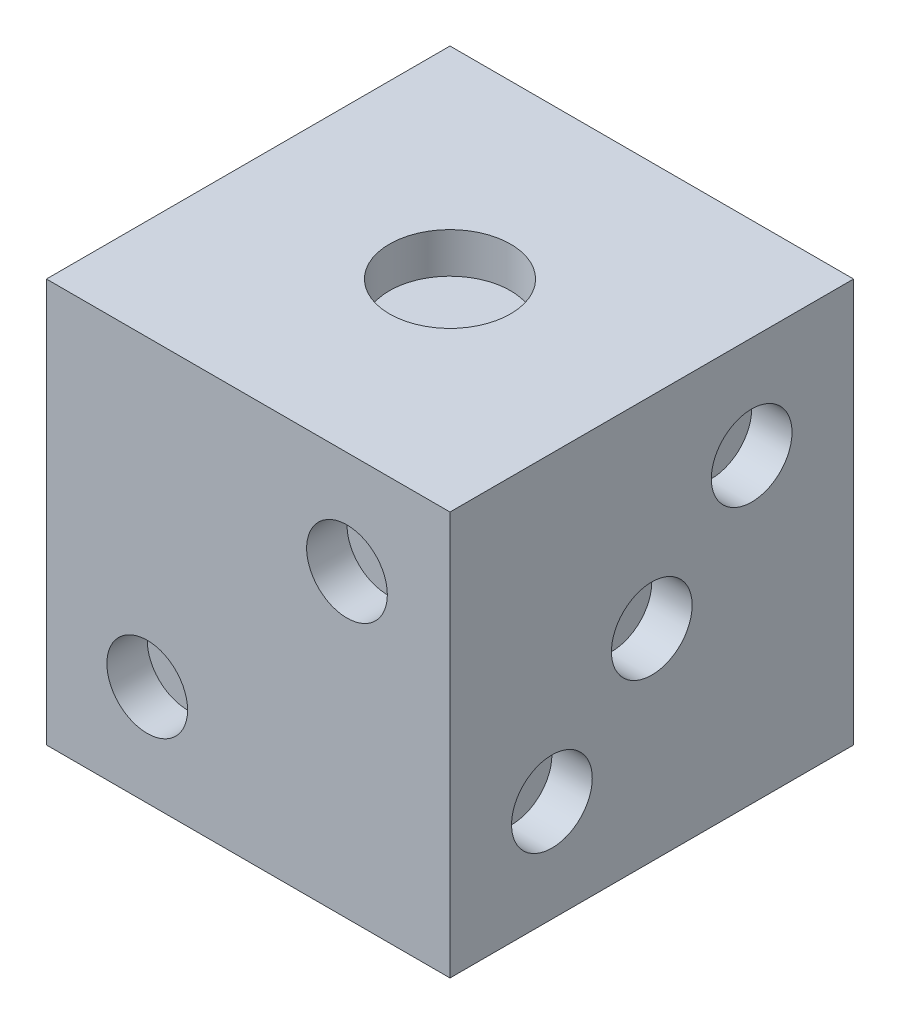
ISO-10303-21;
HEADER;
FILE_DESCRIPTION(('STEP AP214'),'2;1');
FILE_NAME('part.step','',(''),(''),'','','');
FILE_SCHEMA(('AUTOMOTIVE_DESIGN { 1 0 10303 214 1 1 1 1 }'));
ENDSEC;
DATA;
#1=APPLICATION_CONTEXT('core data for automotive mechanical design processes');
#2=APPLICATION_PROTOCOL_DEFINITION('international standard','automotive_design',2000,#1);
#3=PRODUCT_CONTEXT('',#1,'mechanical');
#4=PRODUCT('Part','Part','',(#3));
#5=PRODUCT_RELATED_PRODUCT_CATEGORY('part','',(#4));
#6=PRODUCT_DEFINITION_FORMATION('','',#4);
#7=PRODUCT_DEFINITION_CONTEXT('part definition',#1,'design');
#8=PRODUCT_DEFINITION('design','',#6,#7);
#9=PRODUCT_DEFINITION_SHAPE('','',#8);
#10=(LENGTH_UNIT() NAMED_UNIT(*) SI_UNIT(.MILLI.,.METRE.));
#11=(NAMED_UNIT(*) PLANE_ANGLE_UNIT() SI_UNIT($,.RADIAN.));
#12=(NAMED_UNIT(*) SI_UNIT($,.STERADIAN.) SOLID_ANGLE_UNIT());
#13=UNCERTAINTY_MEASURE_WITH_UNIT(LENGTH_MEASURE(1.E-05),#10,'distance_accuracy_value','');
#14=(GEOMETRIC_REPRESENTATION_CONTEXT(3) GLOBAL_UNCERTAINTY_ASSIGNED_CONTEXT((#13)) GLOBAL_UNIT_ASSIGNED_CONTEXT((#10,
#11,#12)) REPRESENTATION_CONTEXT('',''));
#15=CARTESIAN_POINT('',(0.,0.,0.));
#16=DIRECTION('',(0.,0.,1.));
#17=DIRECTION('',(1.,0.,0.));
#18=AXIS2_PLACEMENT_3D('',#15,#16,#17);
#19=CARTESIAN_POINT('',(-50.,100.,-50.));
#20=DIRECTION('',(1.,0.,0.));
#21=DIRECTION('',(0.,0.,-1.));
#22=AXIS2_PLACEMENT_3D('',#19,#20,#21);
#23=PLANE('',#22);
#24=CARTESIAN_POINT('',(-50.,75.,0.));
#25=DIRECTION('',(-1.,0.,0.));
#26=DIRECTION('',(0.,0.,1.));
#27=AXIS2_PLACEMENT_3D('',#24,#25,#26);
#28=CIRCLE('',#27,12.5);
#29=CARTESIAN_POINT('',(-50.,75.,12.5));
#30=VERTEX_POINT('',#29);
#31=EDGE_CURVE('E281',#30,#30,#28,.T.);
#32=ORIENTED_EDGE('',*,*,#31,.F.);
#33=EDGE_LOOP('',(#32));
#34=FACE_BOUND('',#33,.T.);
#35=CARTESIAN_POINT('',(-50.,75.,35.));
#36=DIRECTION('',(-1.,0.,0.));
#37=DIRECTION('',(0.,0.,1.));
#38=AXIS2_PLACEMENT_3D('',#35,#36,#37);
#39=CIRCLE('',#38,12.5);
#40=CARTESIAN_POINT('',(-50.,75.,47.5));
#41=VERTEX_POINT('',#40);
#42=EDGE_CURVE('E273',#41,#41,#39,.T.);
#43=ORIENTED_EDGE('',*,*,#42,.F.);
#44=EDGE_LOOP('',(#43));
#45=FACE_BOUND('',#44,.T.);
#46=CARTESIAN_POINT('',(-50.,25.,-35.));
#47=DIRECTION('',(-1.,0.,0.));
#48=DIRECTION('',(0.,0.,1.));
#49=AXIS2_PLACEMENT_3D('',#46,#47,#48);
#50=CIRCLE('',#49,12.5);
#51=CARTESIAN_POINT('',(-50.,25.,-22.5));
#52=VERTEX_POINT('',#51);
#53=EDGE_CURVE('E265',#52,#52,#50,.T.);
#54=ORIENTED_EDGE('',*,*,#53,.F.);
#55=EDGE_LOOP('',(#54));
#56=FACE_BOUND('',#55,.T.);
#57=CARTESIAN_POINT('',(-50.,25.,0.));
#58=DIRECTION('',(-1.,0.,0.));
#59=DIRECTION('',(0.,0.,1.));
#60=AXIS2_PLACEMENT_3D('',#57,#58,#59);
#61=CIRCLE('',#60,12.5);
#62=CARTESIAN_POINT('',(-50.,25.,12.5));
#63=VERTEX_POINT('',#62);
#64=EDGE_CURVE('E256',#63,#63,#61,.T.);
#65=ORIENTED_EDGE('',*,*,#64,.F.);
#66=EDGE_LOOP('',(#65));
#67=FACE_BOUND('',#66,.T.);
#68=CARTESIAN_POINT('',(-50.,25.,35.));
#69=DIRECTION('',(-1.,0.,0.));
#70=DIRECTION('',(0.,0.,1.));
#71=AXIS2_PLACEMENT_3D('',#68,#69,#70);
#72=CIRCLE('',#71,12.5);
#73=CARTESIAN_POINT('',(-50.,25.,47.5));
#74=VERTEX_POINT('',#73);
#75=EDGE_CURVE('E288',#74,#74,#72,.T.);
#76=ORIENTED_EDGE('',*,*,#75,.F.);
#77=EDGE_LOOP('',(#76));
#78=FACE_BOUND('',#77,.T.);
#79=CARTESIAN_POINT('',(-50.,75.,-35.));
#80=DIRECTION('',(-1.,0.,0.));
#81=DIRECTION('',(0.,0.,1.));
#82=AXIS2_PLACEMENT_3D('',#79,#80,#81);
#83=CIRCLE('',#82,12.5);
#84=CARTESIAN_POINT('',(-50.,75.,-22.5));
#85=VERTEX_POINT('',#84);
#86=EDGE_CURVE('E248',#85,#85,#83,.T.);
#87=ORIENTED_EDGE('',*,*,#86,.F.);
#88=EDGE_LOOP('',(#87));
#89=FACE_BOUND('',#88,.T.);
#90=DIRECTION('',(0.,0.,1.));
#91=VECTOR('',#90,1.);
#92=CARTESIAN_POINT('',(-50.,0.,-50.));
#93=LINE('',#92,#91);
#94=CARTESIAN_POINT('',(-50.,0.,-50.));
#95=VERTEX_POINT('',#94);
#96=CARTESIAN_POINT('',(-50.,0.,50.));
#97=VERTEX_POINT('',#96);
#98=EDGE_CURVE('E109',#95,#97,#93,.T.);
#99=ORIENTED_EDGE('',*,*,#98,.T.);
#100=DIRECTION('',(0.,-1.,0.));
#101=VECTOR('',#100,1.);
#102=CARTESIAN_POINT('',(-50.,100.,50.));
#103=LINE('',#102,#101);
#104=CARTESIAN_POINT('',(-50.,100.,50.));
#105=VERTEX_POINT('',#104);
#106=EDGE_CURVE('E11',#105,#97,#103,.T.);
#107=ORIENTED_EDGE('',*,*,#106,.F.);
#108=DIRECTION('',(0.,0.,1.));
#109=VECTOR('',#108,1.);
#110=CARTESIAN_POINT('',(-50.,100.,-50.));
#111=LINE('',#110,#109);
#112=CARTESIAN_POINT('',(-50.,100.,-50.));
#113=VERTEX_POINT('',#112);
#114=EDGE_CURVE('E91',#113,#105,#111,.T.);
#115=ORIENTED_EDGE('',*,*,#114,.F.);
#116=DIRECTION('',(0.,-1.,0.));
#117=VECTOR('',#116,1.);
#118=CARTESIAN_POINT('',(-50.,100.,-50.));
#119=LINE('',#118,#117);
#120=EDGE_CURVE('E58',#113,#95,#119,.T.);
#121=ORIENTED_EDGE('',*,*,#120,.T.);
#122=EDGE_LOOP('',(#99,#107,#115,#121));
#123=FACE_BOUND('',#122,.T.);
#124=ADVANCED_FACE('F41',(#34,#45,#56,#67,#78,#89,#123),#23,.F.);
#125=CARTESIAN_POINT('',(-50.,100.,50.));
#126=DIRECTION('',(0.,0.,-1.));
#127=DIRECTION('',(-1.,0.,0.));
#128=AXIS2_PLACEMENT_3D('',#125,#126,#127);
#129=PLANE('',#128);
#130=CARTESIAN_POINT('',(-25.023456698916,24.976543301084,50.));
#131=DIRECTION('',(0.,0.,1.));
#132=DIRECTION('',(1.,0.,0.));
#133=AXIS2_PLACEMENT_3D('',#130,#131,#132);
#134=CIRCLE('',#133,10.);
#135=CARTESIAN_POINT('',(-15.0234566989159,24.976543301084,50.));
#136=VERTEX_POINT('',#135);
#137=EDGE_CURVE('E169',#136,#136,#134,.T.);
#138=ORIENTED_EDGE('',*,*,#137,.F.);
#139=EDGE_LOOP('',(#138));
#140=FACE_BOUND('',#139,.T.);
#141=CARTESIAN_POINT('',(24.4740179841424,74.4740179841423,50.));
#142=DIRECTION('',(0.,0.,1.));
#143=DIRECTION('',(1.,0.,0.));
#144=AXIS2_PLACEMENT_3D('',#141,#142,#143);
#145=CIRCLE('',#144,9.99999999999999);
#146=CARTESIAN_POINT('',(34.4740179841424,74.4740179841423,50.));
#147=VERTEX_POINT('',#146);
#148=EDGE_CURVE('E160',#147,#147,#145,.T.);
#149=ORIENTED_EDGE('',*,*,#148,.F.);
#150=EDGE_LOOP('',(#149));
#151=FACE_BOUND('',#150,.T.);
#152=DIRECTION('',(1.,0.,0.));
#153=VECTOR('',#152,1.);
#154=CARTESIAN_POINT('',(-50.,0.,50.));
#155=LINE('',#154,#153);
#156=CARTESIAN_POINT('',(50.,0.,50.));
#157=VERTEX_POINT('',#156);
#158=EDGE_CURVE('E97',#97,#157,#155,.T.);
#159=ORIENTED_EDGE('',*,*,#158,.T.);
#160=DIRECTION('',(0.,-1.,0.));
#161=VECTOR('',#160,1.);
#162=CARTESIAN_POINT('',(50.,100.,50.));
#163=LINE('',#162,#161);
#164=CARTESIAN_POINT('',(50.,100.,50.));
#165=VERTEX_POINT('',#164);
#166=EDGE_CURVE('E50',#165,#157,#163,.T.);
#167=ORIENTED_EDGE('',*,*,#166,.F.);
#168=DIRECTION('',(1.,0.,0.));
#169=VECTOR('',#168,1.);
#170=CARTESIAN_POINT('',(-50.,100.,50.));
#171=LINE('',#170,#169);
#172=EDGE_CURVE('E83',#105,#165,#171,.T.);
#173=ORIENTED_EDGE('',*,*,#172,.F.);
#174=ORIENTED_EDGE('',*,*,#106,.T.);
#175=EDGE_LOOP('',(#159,#167,#173,#174));
#176=FACE_BOUND('',#175,.T.);
#177=ADVANCED_FACE('F96',(#140,#151,#176),#129,.F.);
#178=CARTESIAN_POINT('',(50.,100.,-50.));
#179=DIRECTION('',(1.,0.,0.));
#180=DIRECTION('',(0.,0.,-1.));
#181=AXIS2_PLACEMENT_3D('',#178,#179,#180);
#182=PLANE('',#181);
#183=CARTESIAN_POINT('',(50.,25.2512626584708,24.7487373415292));
#184=DIRECTION('',(1.,0.,0.));
#185=DIRECTION('',(0.,0.,-1.));
#186=AXIS2_PLACEMENT_3D('',#183,#184,#185);
#187=CIRCLE('',#186,10.);
#188=CARTESIAN_POINT('',(50.,25.2512626584708,14.7487373415292));
#189=VERTEX_POINT('',#188);
#190=EDGE_CURVE('E144',#189,#189,#187,.T.);
#191=ORIENTED_EDGE('',*,*,#190,.F.);
#192=EDGE_LOOP('',(#191));
#193=FACE_BOUND('',#192,.T.);
#194=CARTESIAN_POINT('',(50.,74.7487373415292,-24.7487373415292));
#195=DIRECTION('',(1.,0.,0.));
#196=DIRECTION('',(0.,0.,-1.));
#197=AXIS2_PLACEMENT_3D('',#194,#195,#196);
#198=CIRCLE('',#197,9.99999999999999);
#199=CARTESIAN_POINT('',(50.,74.7487373415292,-34.7487373415292));
#200=VERTEX_POINT('',#199);
#201=EDGE_CURVE('E153',#200,#200,#198,.T.);
#202=ORIENTED_EDGE('',*,*,#201,.F.);
#203=EDGE_LOOP('',(#202));
#204=FACE_BOUND('',#203,.T.);
#205=CARTESIAN_POINT('',(50.,50.,0.));
#206=DIRECTION('',(1.,0.,0.));
#207=DIRECTION('',(0.,0.,-1.));
#208=AXIS2_PLACEMENT_3D('',#205,#206,#207);
#209=CIRCLE('',#208,10.);
#210=CARTESIAN_POINT('',(50.,50.,-10.));
#211=VERTEX_POINT('',#210);
#212=EDGE_CURVE('E136',#211,#211,#209,.T.);
#213=ORIENTED_EDGE('',*,*,#212,.F.);
#214=EDGE_LOOP('',(#213));
#215=FACE_BOUND('',#214,.T.);
#216=DIRECTION('',(0.,0.,1.));
#217=VECTOR('',#216,1.);
#218=CARTESIAN_POINT('',(50.,0.,-50.));
#219=LINE('',#218,#217);
#220=CARTESIAN_POINT('',(50.,0.,-50.));
#221=VERTEX_POINT('',#220);
#222=EDGE_CURVE('E115',#221,#157,#219,.T.);
#223=ORIENTED_EDGE('',*,*,#222,.F.);
#224=DIRECTION('',(0.,-1.,0.));
#225=VECTOR('',#224,1.);
#226=CARTESIAN_POINT('',(50.,100.,-50.));
#227=LINE('',#226,#225);
#228=CARTESIAN_POINT('',(50.,100.,-50.));
#229=VERTEX_POINT('',#228);
#230=EDGE_CURVE('E72',#229,#221,#227,.T.);
#231=ORIENTED_EDGE('',*,*,#230,.F.);
#232=DIRECTION('',(0.,0.,1.));
#233=VECTOR('',#232,1.);
#234=CARTESIAN_POINT('',(50.,100.,-50.));
#235=LINE('',#234,#233);
#236=EDGE_CURVE('E90',#229,#165,#235,.T.);
#237=ORIENTED_EDGE('',*,*,#236,.T.);
#238=ORIENTED_EDGE('',*,*,#166,.T.);
#239=EDGE_LOOP('',(#223,#231,#237,#238));
#240=FACE_BOUND('',#239,.T.);
#241=ADVANCED_FACE('F101',(#193,#204,#215,#240),#182,.T.);
#242=CARTESIAN_POINT('',(-50.,100.,-50.));
#243=DIRECTION('',(0.,0.,-1.));
#244=DIRECTION('',(-1.,0.,0.));
#245=AXIS2_PLACEMENT_3D('',#242,#243,#244);
#246=PLANE('',#245);
#247=CARTESIAN_POINT('',(25.,25.,-50.));
#248=DIRECTION('',(0.,0.,-1.));
#249=DIRECTION('',(-1.,0.,0.));
#250=AXIS2_PLACEMENT_3D('',#247,#248,#249);
#251=CIRCLE('',#250,12.5);
#252=CARTESIAN_POINT('',(12.5,25.,-50.));
#253=VERTEX_POINT('',#252);
#254=EDGE_CURVE('E225',#253,#253,#251,.T.);
#255=ORIENTED_EDGE('',*,*,#254,.F.);
#256=EDGE_LOOP('',(#255));
#257=FACE_BOUND('',#256,.T.);
#258=CARTESIAN_POINT('',(-25.,75.,-50.));
#259=DIRECTION('',(0.,0.,-1.));
#260=DIRECTION('',(-1.,0.,0.));
#261=AXIS2_PLACEMENT_3D('',#258,#259,#260);
#262=CIRCLE('',#261,12.5);
#263=CARTESIAN_POINT('',(-37.5,75.,-50.));
#264=VERTEX_POINT('',#263);
#265=EDGE_CURVE('E216',#264,#264,#262,.T.);
#266=ORIENTED_EDGE('',*,*,#265,.F.);
#267=EDGE_LOOP('',(#266));
#268=FACE_BOUND('',#267,.T.);
#269=CARTESIAN_POINT('',(0.,50.,-50.));
#270=DIRECTION('',(0.,0.,-1.));
#271=DIRECTION('',(-1.,0.,0.));
#272=AXIS2_PLACEMENT_3D('',#269,#270,#271);
#273=CIRCLE('',#272,12.5);
#274=CARTESIAN_POINT('',(-12.5,50.,-50.));
#275=VERTEX_POINT('',#274);
#276=EDGE_CURVE('E240',#275,#275,#273,.T.);
#277=ORIENTED_EDGE('',*,*,#276,.F.);
#278=EDGE_LOOP('',(#277));
#279=FACE_BOUND('',#278,.T.);
#280=CARTESIAN_POINT('',(25.,75.,-50.));
#281=DIRECTION('',(0.,0.,-1.));
#282=DIRECTION('',(-1.,0.,0.));
#283=AXIS2_PLACEMENT_3D('',#280,#281,#282);
#284=CIRCLE('',#283,12.5);
#285=CARTESIAN_POINT('',(12.5,75.,-50.));
#286=VERTEX_POINT('',#285);
#287=EDGE_CURVE('E232',#286,#286,#284,.T.);
#288=ORIENTED_EDGE('',*,*,#287,.F.);
#289=EDGE_LOOP('',(#288));
#290=FACE_BOUND('',#289,.T.);
#291=CARTESIAN_POINT('',(-25.,25.,-50.));
#292=DIRECTION('',(0.,0.,-1.));
#293=DIRECTION('',(-1.,0.,0.));
#294=AXIS2_PLACEMENT_3D('',#291,#292,#293);
#295=CIRCLE('',#294,12.5);
#296=CARTESIAN_POINT('',(-37.5,25.,-50.));
#297=VERTEX_POINT('',#296);
#298=EDGE_CURVE('E208',#297,#297,#295,.T.);
#299=ORIENTED_EDGE('',*,*,#298,.F.);
#300=EDGE_LOOP('',(#299));
#301=FACE_BOUND('',#300,.T.);
#302=DIRECTION('',(1.,0.,0.));
#303=VECTOR('',#302,1.);
#304=CARTESIAN_POINT('',(-50.,0.,-50.));
#305=LINE('',#304,#303);
#306=EDGE_CURVE('E118',#95,#221,#305,.T.);
#307=ORIENTED_EDGE('',*,*,#306,.F.);
#308=ORIENTED_EDGE('',*,*,#120,.F.);
#309=DIRECTION('',(1.,0.,0.));
#310=VECTOR('',#309,1.);
#311=CARTESIAN_POINT('',(-50.,100.,-50.));
#312=LINE('',#311,#310);
#313=EDGE_CURVE('E103',#113,#229,#312,.T.);
#314=ORIENTED_EDGE('',*,*,#313,.T.);
#315=ORIENTED_EDGE('',*,*,#230,.T.);
#316=EDGE_LOOP('',(#307,#308,#314,#315));
#317=FACE_BOUND('',#316,.T.);
#318=ADVANCED_FACE('F310',(#257,#268,#279,#290,#301,#317),#246,.T.);
#319=CARTESIAN_POINT('',(0.,100.,0.));
#320=DIRECTION('',(0.,1.,0.));
#321=DIRECTION('',(0.,0.,1.));
#322=AXIS2_PLACEMENT_3D('',#319,#320,#321);
#323=PLANE('',#322);
#324=CARTESIAN_POINT('',(0.,100.,0.));
#325=DIRECTION('',(0.,1.,0.));
#326=DIRECTION('',(0.,0.,1.));
#327=AXIS2_PLACEMENT_3D('',#324,#325,#326);
#328=CIRCLE('',#327,15.);
#329=CARTESIAN_POINT('',(0.,100.,15.));
#330=VERTEX_POINT('',#329);
#331=EDGE_CURVE('E128',#330,#330,#328,.T.);
#332=ORIENTED_EDGE('',*,*,#331,.F.);
#333=EDGE_LOOP('',(#332));
#334=FACE_BOUND('',#333,.T.);
#335=ORIENTED_EDGE('',*,*,#114,.T.);
#336=ORIENTED_EDGE('',*,*,#172,.T.);
#337=ORIENTED_EDGE('',*,*,#236,.F.);
#338=ORIENTED_EDGE('',*,*,#313,.F.);
#339=EDGE_LOOP('',(#335,#336,#337,#338));
#340=FACE_BOUND('',#339,.T.);
#341=ADVANCED_FACE('F87',(#334,#340),#323,.T.);
#342=CARTESIAN_POINT('',(0.,0.,0.));
#343=DIRECTION('',(0.,1.,0.));
#344=DIRECTION('',(0.,0.,1.));
#345=AXIS2_PLACEMENT_3D('',#342,#343,#344);
#346=PLANE('',#345);
#347=CARTESIAN_POINT('',(25.,0.,-25.));
#348=DIRECTION('',(0.,-1.,0.));
#349=DIRECTION('',(0.,0.,-1.));
#350=AXIS2_PLACEMENT_3D('',#347,#348,#349);
#351=CIRCLE('',#350,12.5);
#352=CARTESIAN_POINT('',(25.,0.,-37.5));
#353=VERTEX_POINT('',#352);
#354=EDGE_CURVE('E184',#353,#353,#351,.T.);
#355=ORIENTED_EDGE('',*,*,#354,.F.);
#356=EDGE_LOOP('',(#355));
#357=FACE_BOUND('',#356,.T.);
#358=CARTESIAN_POINT('',(25.,0.,25.));
#359=DIRECTION('',(0.,-1.,0.));
#360=DIRECTION('',(0.,0.,-1.));
#361=AXIS2_PLACEMENT_3D('',#358,#359,#360);
#362=CIRCLE('',#361,12.5);
#363=CARTESIAN_POINT('',(25.,0.,12.5));
#364=VERTEX_POINT('',#363);
#365=EDGE_CURVE('E193',#364,#364,#362,.T.);
#366=ORIENTED_EDGE('',*,*,#365,.F.);
#367=EDGE_LOOP('',(#366));
#368=FACE_BOUND('',#367,.T.);
#369=CARTESIAN_POINT('',(-25.,0.,25.));
#370=DIRECTION('',(0.,-1.,0.));
#371=DIRECTION('',(0.,0.,-1.));
#372=AXIS2_PLACEMENT_3D('',#369,#370,#371);
#373=CIRCLE('',#372,12.5);
#374=CARTESIAN_POINT('',(-25.,0.,12.5));
#375=VERTEX_POINT('',#374);
#376=EDGE_CURVE('E201',#375,#375,#373,.T.);
#377=ORIENTED_EDGE('',*,*,#376,.F.);
#378=EDGE_LOOP('',(#377));
#379=FACE_BOUND('',#378,.T.);
#380=CARTESIAN_POINT('',(-25.,0.,-25.));
#381=DIRECTION('',(0.,-1.,0.));
#382=DIRECTION('',(0.,0.,-1.));
#383=AXIS2_PLACEMENT_3D('',#380,#381,#382);
#384=CIRCLE('',#383,12.5);
#385=CARTESIAN_POINT('',(-25.,0.,-37.5));
#386=VERTEX_POINT('',#385);
#387=EDGE_CURVE('E176',#386,#386,#384,.T.);
#388=ORIENTED_EDGE('',*,*,#387,.F.);
#389=EDGE_LOOP('',(#388));
#390=FACE_BOUND('',#389,.T.);
#391=ORIENTED_EDGE('',*,*,#98,.F.);
#392=ORIENTED_EDGE('',*,*,#306,.T.);
#393=ORIENTED_EDGE('',*,*,#222,.T.);
#394=ORIENTED_EDGE('',*,*,#158,.F.);
#395=EDGE_LOOP('',(#391,#392,#393,#394));
#396=FACE_BOUND('',#395,.T.);
#397=ADVANCED_FACE('F309',(#357,#368,#379,#390,#396),#346,.F.);
#398=CARTESIAN_POINT('',(0.,90.,0.));
#399=DIRECTION('',(0.,1.,0.));
#400=DIRECTION('',(0.,0.,1.));
#401=AXIS2_PLACEMENT_3D('',#398,#399,#400);
#402=CYLINDRICAL_SURFACE('',#401,15.);
#403=CARTESIAN_POINT('',(0.,90.,0.));
#404=DIRECTION('',(0.,1.,0.));
#405=DIRECTION('',(0.,0.,1.));
#406=AXIS2_PLACEMENT_3D('',#403,#404,#405);
#407=CIRCLE('',#406,15.);
#408=CARTESIAN_POINT('',(0.,90.,15.));
#409=VERTEX_POINT('',#408);
#410=EDGE_CURVE('E112',#409,#409,#407,.T.);
#411=ORIENTED_EDGE('',*,*,#410,.F.);
#412=EDGE_LOOP('',(#411));
#413=FACE_BOUND('',#412,.T.);
#414=ORIENTED_EDGE('',*,*,#331,.T.);
#415=EDGE_LOOP('',(#414));
#416=FACE_BOUND('',#415,.T.);
#417=ADVANCED_FACE('F374',(#413,#416),#402,.F.);
#418=CARTESIAN_POINT('',(0.,90.,0.));
#419=DIRECTION('',(0.,1.,0.));
#420=DIRECTION('',(0.,0.,1.));
#421=AXIS2_PLACEMENT_3D('',#418,#419,#420);
#422=PLANE('',#421);
#423=ORIENTED_EDGE('',*,*,#410,.T.);
#424=EDGE_LOOP('',(#423));
#425=FACE_BOUND('',#424,.T.);
#426=ADVANCED_FACE('F370',(#425),#422,.T.);
#427=CARTESIAN_POINT('',(40.,50.,0.));
#428=DIRECTION('',(1.,0.,0.));
#429=DIRECTION('',(0.,0.,-1.));
#430=AXIS2_PLACEMENT_3D('',#427,#428,#429);
#431=CYLINDRICAL_SURFACE('',#430,10.);
#432=CARTESIAN_POINT('',(40.,50.,0.));
#433=DIRECTION('',(1.,0.,0.));
#434=DIRECTION('',(0.,0.,-1.));
#435=AXIS2_PLACEMENT_3D('',#432,#433,#434);
#436=CIRCLE('',#435,10.);
#437=CARTESIAN_POINT('',(40.,50.,-10.));
#438=VERTEX_POINT('',#437);
#439=EDGE_CURVE('E132',#438,#438,#436,.T.);
#440=ORIENTED_EDGE('',*,*,#439,.F.);
#441=EDGE_LOOP('',(#440));
#442=FACE_BOUND('',#441,.T.);
#443=ORIENTED_EDGE('',*,*,#212,.T.);
#444=EDGE_LOOP('',(#443));
#445=FACE_BOUND('',#444,.T.);
#446=ADVANCED_FACE('F366',(#442,#445),#431,.F.);
#447=CARTESIAN_POINT('',(40.,50.,0.));
#448=DIRECTION('',(1.,0.,0.));
#449=DIRECTION('',(0.,0.,-1.));
#450=AXIS2_PLACEMENT_3D('',#447,#448,#449);
#451=PLANE('',#450);
#452=ORIENTED_EDGE('',*,*,#439,.T.);
#453=EDGE_LOOP('',(#452));
#454=FACE_BOUND('',#453,.T.);
#455=ADVANCED_FACE('F358',(#454),#451,.T.);
#456=CARTESIAN_POINT('',(40.,74.7487373415292,-24.7487373415292));
#457=DIRECTION('',(1.,0.,0.));
#458=DIRECTION('',(0.,0.,-1.));
#459=AXIS2_PLACEMENT_3D('',#456,#457,#458);
#460=CYLINDRICAL_SURFACE('',#459,9.99999999999999);
#461=CARTESIAN_POINT('',(40.,74.7487373415292,-24.7487373415292));
#462=DIRECTION('',(1.,0.,0.));
#463=DIRECTION('',(0.,0.,-1.));
#464=AXIS2_PLACEMENT_3D('',#461,#462,#463);
#465=CIRCLE('',#464,9.99999999999999);
#466=CARTESIAN_POINT('',(40.,74.7487373415292,-34.7487373415292));
#467=VERTEX_POINT('',#466);
#468=EDGE_CURVE('E140',#467,#467,#465,.T.);
#469=ORIENTED_EDGE('',*,*,#468,.F.);
#470=EDGE_LOOP('',(#469));
#471=FACE_BOUND('',#470,.T.);
#472=ORIENTED_EDGE('',*,*,#201,.T.);
#473=EDGE_LOOP('',(#472));
#474=FACE_BOUND('',#473,.T.);
#475=ADVANCED_FACE('F355',(#471,#474),#460,.F.);
#476=CARTESIAN_POINT('',(40.,74.7487373415292,-24.7487373415292));
#477=DIRECTION('',(1.,0.,0.));
#478=DIRECTION('',(0.,0.,-1.));
#479=AXIS2_PLACEMENT_3D('',#476,#477,#478);
#480=PLANE('',#479);
#481=ORIENTED_EDGE('',*,*,#468,.T.);
#482=EDGE_LOOP('',(#481));
#483=FACE_BOUND('',#482,.T.);
#484=ADVANCED_FACE('F352',(#483),#480,.T.);
#485=CARTESIAN_POINT('',(40.,25.2512626584708,24.7487373415292));
#486=DIRECTION('',(1.,0.,0.));
#487=DIRECTION('',(0.,0.,-1.));
#488=AXIS2_PLACEMENT_3D('',#485,#486,#487);
#489=CYLINDRICAL_SURFACE('',#488,10.);
#490=CARTESIAN_POINT('',(40.,25.2512626584708,24.7487373415292));
#491=DIRECTION('',(1.,0.,0.));
#492=DIRECTION('',(0.,0.,-1.));
#493=AXIS2_PLACEMENT_3D('',#490,#491,#492);
#494=CIRCLE('',#493,10.);
#495=CARTESIAN_POINT('',(40.,25.2512626584708,14.7487373415292));
#496=VERTEX_POINT('',#495);
#497=EDGE_CURVE('E148',#496,#496,#494,.T.);
#498=ORIENTED_EDGE('',*,*,#497,.F.);
#499=EDGE_LOOP('',(#498));
#500=FACE_BOUND('',#499,.T.);
#501=ORIENTED_EDGE('',*,*,#190,.T.);
#502=EDGE_LOOP('',(#501));
#503=FACE_BOUND('',#502,.T.);
#504=ADVANCED_FACE('F346',(#500,#503),#489,.F.);
#505=CARTESIAN_POINT('',(40.,25.2512626584708,24.7487373415292));
#506=DIRECTION('',(1.,0.,0.));
#507=DIRECTION('',(0.,0.,-1.));
#508=AXIS2_PLACEMENT_3D('',#505,#506,#507);
#509=PLANE('',#508);
#510=ORIENTED_EDGE('',*,*,#497,.T.);
#511=EDGE_LOOP('',(#510));
#512=FACE_BOUND('',#511,.T.);
#513=ADVANCED_FACE('F336',(#512),#509,.T.);
#514=CARTESIAN_POINT('',(24.4740179841424,74.4740179841423,40.));
#515=DIRECTION('',(0.,0.,1.));
#516=DIRECTION('',(1.,0.,0.));
#517=AXIS2_PLACEMENT_3D('',#514,#515,#516);
#518=CYLINDRICAL_SURFACE('',#517,9.99999999999999);
#519=CARTESIAN_POINT('',(24.4740179841424,74.4740179841423,40.));
#520=DIRECTION('',(0.,0.,1.));
#521=DIRECTION('',(1.,0.,0.));
#522=AXIS2_PLACEMENT_3D('',#519,#520,#521);
#523=CIRCLE('',#522,9.99999999999999);
#524=CARTESIAN_POINT('',(34.4740179841424,74.4740179841423,40.));
#525=VERTEX_POINT('',#524);
#526=EDGE_CURVE('E164',#525,#525,#523,.T.);
#527=ORIENTED_EDGE('',*,*,#526,.F.);
#528=EDGE_LOOP('',(#527));
#529=FACE_BOUND('',#528,.T.);
#530=ORIENTED_EDGE('',*,*,#148,.T.);
#531=EDGE_LOOP('',(#530));
#532=FACE_BOUND('',#531,.T.);
#533=ADVANCED_FACE('F333',(#529,#532),#518,.F.);
#534=CARTESIAN_POINT('',(24.4740179841424,74.4740179841423,40.));
#535=DIRECTION('',(0.,0.,1.));
#536=DIRECTION('',(1.,0.,0.));
#537=AXIS2_PLACEMENT_3D('',#534,#535,#536);
#538=PLANE('',#537);
#539=ORIENTED_EDGE('',*,*,#526,.T.);
#540=EDGE_LOOP('',(#539));
#541=FACE_BOUND('',#540,.T.);
#542=ADVANCED_FACE('F335',(#541),#538,.T.);
#543=CARTESIAN_POINT('',(-25.023456698916,24.976543301084,40.));
#544=DIRECTION('',(0.,0.,1.));
#545=DIRECTION('',(1.,0.,0.));
#546=AXIS2_PLACEMENT_3D('',#543,#544,#545);
#547=CYLINDRICAL_SURFACE('',#546,10.);
#548=CARTESIAN_POINT('',(-25.023456698916,24.976543301084,40.));
#549=DIRECTION('',(0.,0.,1.));
#550=DIRECTION('',(1.,0.,0.));
#551=AXIS2_PLACEMENT_3D('',#548,#549,#550);
#552=CIRCLE('',#551,10.);
#553=CARTESIAN_POINT('',(-15.0234566989159,24.976543301084,40.));
#554=VERTEX_POINT('',#553);
#555=EDGE_CURVE('E149',#554,#554,#552,.T.);
#556=ORIENTED_EDGE('',*,*,#555,.F.);
#557=EDGE_LOOP('',(#556));
#558=FACE_BOUND('',#557,.T.);
#559=ORIENTED_EDGE('',*,*,#137,.T.);
#560=EDGE_LOOP('',(#559));
#561=FACE_BOUND('',#560,.T.);
#562=ADVANCED_FACE('F343',(#558,#561),#547,.F.);
#563=CARTESIAN_POINT('',(-25.023456698916,24.976543301084,40.));
#564=DIRECTION('',(0.,0.,1.));
#565=DIRECTION('',(1.,0.,0.));
#566=AXIS2_PLACEMENT_3D('',#563,#564,#565);
#567=PLANE('',#566);
#568=ORIENTED_EDGE('',*,*,#555,.T.);
#569=EDGE_LOOP('',(#568));
#570=FACE_BOUND('',#569,.T.);
#571=ADVANCED_FACE('F398',(#570),#567,.T.);
#572=CARTESIAN_POINT('',(-25.,10.,-25.));
#573=DIRECTION('',(0.,-1.,0.));
#574=DIRECTION('',(0.,0.,-1.));
#575=AXIS2_PLACEMENT_3D('',#572,#573,#574);
#576=CYLINDRICAL_SURFACE('',#575,12.5);
#577=CARTESIAN_POINT('',(-25.,10.,-25.));
#578=DIRECTION('',(0.,-1.,0.));
#579=DIRECTION('',(0.,0.,-1.));
#580=AXIS2_PLACEMENT_3D('',#577,#578,#579);
#581=CIRCLE('',#580,12.5);
#582=CARTESIAN_POINT('',(-25.,10.,-37.5));
#583=VERTEX_POINT('',#582);
#584=EDGE_CURVE('E165',#583,#583,#581,.T.);
#585=ORIENTED_EDGE('',*,*,#584,.F.);
#586=EDGE_LOOP('',(#585));
#587=FACE_BOUND('',#586,.T.);
#588=ORIENTED_EDGE('',*,*,#387,.T.);
#589=EDGE_LOOP('',(#588));
#590=FACE_BOUND('',#589,.T.);
#591=ADVANCED_FACE('F395',(#587,#590),#576,.F.);
#592=CARTESIAN_POINT('',(-25.,10.,-25.));
#593=DIRECTION('',(0.,-1.,0.));
#594=DIRECTION('',(0.,0.,-1.));
#595=AXIS2_PLACEMENT_3D('',#592,#593,#594);
#596=PLANE('',#595);
#597=ORIENTED_EDGE('',*,*,#584,.T.);
#598=EDGE_LOOP('',(#597));
#599=FACE_BOUND('',#598,.T.);
#600=ADVANCED_FACE('F397',(#599),#596,.T.);
#601=CARTESIAN_POINT('',(-25.,10.,25.));
#602=DIRECTION('',(0.,-1.,0.));
#603=DIRECTION('',(0.,0.,-1.));
#604=AXIS2_PLACEMENT_3D('',#601,#602,#603);
#605=CYLINDRICAL_SURFACE('',#604,12.5);
#606=CARTESIAN_POINT('',(-25.,10.,25.));
#607=DIRECTION('',(0.,-1.,0.));
#608=DIRECTION('',(0.,0.,-1.));
#609=AXIS2_PLACEMENT_3D('',#606,#607,#608);
#610=CIRCLE('',#609,12.5);
#611=CARTESIAN_POINT('',(-25.,10.,12.5));
#612=VERTEX_POINT('',#611);
#613=EDGE_CURVE('E180',#612,#612,#610,.T.);
#614=ORIENTED_EDGE('',*,*,#613,.F.);
#615=EDGE_LOOP('',(#614));
#616=FACE_BOUND('',#615,.T.);
#617=ORIENTED_EDGE('',*,*,#376,.T.);
#618=EDGE_LOOP('',(#617));
#619=FACE_BOUND('',#618,.T.);
#620=ADVANCED_FACE('F405',(#616,#619),#605,.F.);
#621=CARTESIAN_POINT('',(-25.,10.,25.));
#622=DIRECTION('',(0.,-1.,0.));
#623=DIRECTION('',(0.,0.,-1.));
#624=AXIS2_PLACEMENT_3D('',#621,#622,#623);
#625=PLANE('',#624);
#626=ORIENTED_EDGE('',*,*,#613,.T.);
#627=EDGE_LOOP('',(#626));
#628=FACE_BOUND('',#627,.T.);
#629=ADVANCED_FACE('F449',(#628),#625,.T.);
#630=CARTESIAN_POINT('',(25.,10.,25.));
#631=DIRECTION('',(0.,-1.,0.));
#632=DIRECTION('',(0.,0.,-1.));
#633=AXIS2_PLACEMENT_3D('',#630,#631,#632);
#634=CYLINDRICAL_SURFACE('',#633,12.5);
#635=CARTESIAN_POINT('',(25.,10.,25.));
#636=DIRECTION('',(0.,-1.,0.));
#637=DIRECTION('',(0.,0.,-1.));
#638=AXIS2_PLACEMENT_3D('',#635,#636,#637);
#639=CIRCLE('',#638,12.5);
#640=CARTESIAN_POINT('',(25.,10.,12.5));
#641=VERTEX_POINT('',#640);
#642=EDGE_CURVE('E197',#641,#641,#639,.T.);
#643=ORIENTED_EDGE('',*,*,#642,.F.);
#644=EDGE_LOOP('',(#643));
#645=FACE_BOUND('',#644,.T.);
#646=ORIENTED_EDGE('',*,*,#365,.T.);
#647=EDGE_LOOP('',(#646));
#648=FACE_BOUND('',#647,.T.);
#649=ADVANCED_FACE('F459',(#645,#648),#634,.F.);
#650=CARTESIAN_POINT('',(25.,10.,25.));
#651=DIRECTION('',(0.,-1.,0.));
#652=DIRECTION('',(0.,0.,-1.));
#653=AXIS2_PLACEMENT_3D('',#650,#651,#652);
#654=PLANE('',#653);
#655=ORIENTED_EDGE('',*,*,#642,.T.);
#656=EDGE_LOOP('',(#655));
#657=FACE_BOUND('',#656,.T.);
#658=ADVANCED_FACE('F469',(#657),#654,.T.);
#659=CARTESIAN_POINT('',(25.,10.,-25.));
#660=DIRECTION('',(0.,-1.,0.));
#661=DIRECTION('',(0.,0.,-1.));
#662=AXIS2_PLACEMENT_3D('',#659,#660,#661);
#663=CYLINDRICAL_SURFACE('',#662,12.5);
#664=CARTESIAN_POINT('',(25.,10.,-25.));
#665=DIRECTION('',(0.,-1.,0.));
#666=DIRECTION('',(0.,0.,-1.));
#667=AXIS2_PLACEMENT_3D('',#664,#665,#666);
#668=CIRCLE('',#667,12.5);
#669=CARTESIAN_POINT('',(25.,10.,-37.5));
#670=VERTEX_POINT('',#669);
#671=EDGE_CURVE('E188',#670,#670,#668,.T.);
#672=ORIENTED_EDGE('',*,*,#671,.F.);
#673=EDGE_LOOP('',(#672));
#674=FACE_BOUND('',#673,.T.);
#675=ORIENTED_EDGE('',*,*,#354,.T.);
#676=EDGE_LOOP('',(#675));
#677=FACE_BOUND('',#676,.T.);
#678=ADVANCED_FACE('F479',(#674,#677),#663,.F.);
#679=CARTESIAN_POINT('',(25.,10.,-25.));
#680=DIRECTION('',(0.,-1.,0.));
#681=DIRECTION('',(0.,0.,-1.));
#682=AXIS2_PLACEMENT_3D('',#679,#680,#681);
#683=PLANE('',#682);
#684=ORIENTED_EDGE('',*,*,#671,.T.);
#685=EDGE_LOOP('',(#684));
#686=FACE_BOUND('',#685,.T.);
#687=ADVANCED_FACE('F489',(#686),#683,.T.);
#688=CARTESIAN_POINT('',(-25.,25.,-40.));
#689=DIRECTION('',(0.,0.,-1.));
#690=DIRECTION('',(-1.,0.,0.));
#691=AXIS2_PLACEMENT_3D('',#688,#689,#690);
#692=CYLINDRICAL_SURFACE('',#691,12.5);
#693=CARTESIAN_POINT('',(-25.,25.,-40.));
#694=DIRECTION('',(0.,0.,-1.));
#695=DIRECTION('',(-1.,0.,0.));
#696=AXIS2_PLACEMENT_3D('',#693,#694,#695);
#697=CIRCLE('',#696,12.5);
#698=CARTESIAN_POINT('',(-37.5,25.,-40.));
#699=VERTEX_POINT('',#698);
#700=EDGE_CURVE('E189',#699,#699,#697,.T.);
#701=ORIENTED_EDGE('',*,*,#700,.F.);
#702=EDGE_LOOP('',(#701));
#703=FACE_BOUND('',#702,.T.);
#704=ORIENTED_EDGE('',*,*,#298,.T.);
#705=EDGE_LOOP('',(#704));
#706=FACE_BOUND('',#705,.T.);
#707=ADVANCED_FACE('F497',(#703,#706),#692,.F.);
#708=CARTESIAN_POINT('',(-25.,25.,-40.));
#709=DIRECTION('',(0.,0.,-1.));
#710=DIRECTION('',(-1.,0.,0.));
#711=AXIS2_PLACEMENT_3D('',#708,#709,#710);
#712=PLANE('',#711);
#713=ORIENTED_EDGE('',*,*,#700,.T.);
#714=EDGE_LOOP('',(#713));
#715=FACE_BOUND('',#714,.T.);
#716=ADVANCED_FACE('F513',(#715),#712,.T.);
#717=CARTESIAN_POINT('',(25.,75.,-40.));
#718=DIRECTION('',(0.,0.,-1.));
#719=DIRECTION('',(-1.,0.,0.));
#720=AXIS2_PLACEMENT_3D('',#717,#718,#719);
#721=CYLINDRICAL_SURFACE('',#720,12.5);
#722=CARTESIAN_POINT('',(25.,75.,-40.));
#723=DIRECTION('',(0.,0.,-1.));
#724=DIRECTION('',(-1.,0.,0.));
#725=AXIS2_PLACEMENT_3D('',#722,#723,#724);
#726=CIRCLE('',#725,12.5);
#727=CARTESIAN_POINT('',(12.5,75.,-40.));
#728=VERTEX_POINT('',#727);
#729=EDGE_CURVE('E221',#728,#728,#726,.T.);
#730=ORIENTED_EDGE('',*,*,#729,.F.);
#731=EDGE_LOOP('',(#730));
#732=FACE_BOUND('',#731,.T.);
#733=ORIENTED_EDGE('',*,*,#287,.T.);
#734=EDGE_LOOP('',(#733));
#735=FACE_BOUND('',#734,.T.);
#736=ADVANCED_FACE('F523',(#732,#735),#721,.F.);
#737=CARTESIAN_POINT('',(25.,75.,-40.));
#738=DIRECTION('',(0.,0.,-1.));
#739=DIRECTION('',(-1.,0.,0.));
#740=AXIS2_PLACEMENT_3D('',#737,#738,#739);
#741=PLANE('',#740);
#742=ORIENTED_EDGE('',*,*,#729,.T.);
#743=EDGE_LOOP('',(#742));
#744=FACE_BOUND('',#743,.T.);
#745=ADVANCED_FACE('F533',(#744),#741,.T.);
#746=CARTESIAN_POINT('',(0.,50.,-40.));
#747=DIRECTION('',(0.,0.,-1.));
#748=DIRECTION('',(-1.,0.,0.));
#749=AXIS2_PLACEMENT_3D('',#746,#747,#748);
#750=CYLINDRICAL_SURFACE('',#749,12.5);
#751=CARTESIAN_POINT('',(0.,50.,-40.));
#752=DIRECTION('',(0.,0.,-1.));
#753=DIRECTION('',(-1.,0.,0.));
#754=AXIS2_PLACEMENT_3D('',#751,#752,#753);
#755=CIRCLE('',#754,12.5);
#756=CARTESIAN_POINT('',(-12.5,50.,-40.));
#757=VERTEX_POINT('',#756);
#758=EDGE_CURVE('E236',#757,#757,#755,.T.);
#759=ORIENTED_EDGE('',*,*,#758,.F.);
#760=EDGE_LOOP('',(#759));
#761=FACE_BOUND('',#760,.T.);
#762=ORIENTED_EDGE('',*,*,#276,.T.);
#763=EDGE_LOOP('',(#762));
#764=FACE_BOUND('',#763,.T.);
#765=ADVANCED_FACE('F543',(#761,#764),#750,.F.);
#766=CARTESIAN_POINT('',(0.,50.,-40.));
#767=DIRECTION('',(0.,0.,-1.));
#768=DIRECTION('',(-1.,0.,0.));
#769=AXIS2_PLACEMENT_3D('',#766,#767,#768);
#770=PLANE('',#769);
#771=ORIENTED_EDGE('',*,*,#758,.T.);
#772=EDGE_LOOP('',(#771));
#773=FACE_BOUND('',#772,.T.);
#774=ADVANCED_FACE('F553',(#773),#770,.T.);
#775=CARTESIAN_POINT('',(-25.,75.,-40.));
#776=DIRECTION('',(0.,0.,-1.));
#777=DIRECTION('',(-1.,0.,0.));
#778=AXIS2_PLACEMENT_3D('',#775,#776,#777);
#779=CYLINDRICAL_SURFACE('',#778,12.5);
#780=CARTESIAN_POINT('',(-25.,75.,-40.));
#781=DIRECTION('',(0.,0.,-1.));
#782=DIRECTION('',(-1.,0.,0.));
#783=AXIS2_PLACEMENT_3D('',#780,#781,#782);
#784=CIRCLE('',#783,12.5);
#785=CARTESIAN_POINT('',(-37.5,75.,-40.));
#786=VERTEX_POINT('',#785);
#787=EDGE_CURVE('E220',#786,#786,#784,.T.);
#788=ORIENTED_EDGE('',*,*,#787,.F.);
#789=EDGE_LOOP('',(#788));
#790=FACE_BOUND('',#789,.T.);
#791=ORIENTED_EDGE('',*,*,#265,.T.);
#792=EDGE_LOOP('',(#791));
#793=FACE_BOUND('',#792,.T.);
#794=ADVANCED_FACE('F563',(#790,#793),#779,.F.);
#795=CARTESIAN_POINT('',(-25.,75.,-40.));
#796=DIRECTION('',(0.,0.,-1.));
#797=DIRECTION('',(-1.,0.,0.));
#798=AXIS2_PLACEMENT_3D('',#795,#796,#797);
#799=PLANE('',#798);
#800=ORIENTED_EDGE('',*,*,#787,.T.);
#801=EDGE_LOOP('',(#800));
#802=FACE_BOUND('',#801,.T.);
#803=ADVANCED_FACE('F573',(#802),#799,.T.);
#804=CARTESIAN_POINT('',(25.,25.,-40.));
#805=DIRECTION('',(0.,0.,-1.));
#806=DIRECTION('',(-1.,0.,0.));
#807=AXIS2_PLACEMENT_3D('',#804,#805,#806);
#808=CYLINDRICAL_SURFACE('',#807,12.5);
#809=CARTESIAN_POINT('',(25.,25.,-40.));
#810=DIRECTION('',(0.,0.,-1.));
#811=DIRECTION('',(-1.,0.,0.));
#812=AXIS2_PLACEMENT_3D('',#809,#810,#811);
#813=CIRCLE('',#812,12.5);
#814=CARTESIAN_POINT('',(12.5,25.,-40.));
#815=VERTEX_POINT('',#814);
#816=EDGE_CURVE('E212',#815,#815,#813,.T.);
#817=ORIENTED_EDGE('',*,*,#816,.F.);
#818=EDGE_LOOP('',(#817));
#819=FACE_BOUND('',#818,.T.);
#820=ORIENTED_EDGE('',*,*,#254,.T.);
#821=EDGE_LOOP('',(#820));
#822=FACE_BOUND('',#821,.T.);
#823=ADVANCED_FACE('F583',(#819,#822),#808,.F.);
#824=CARTESIAN_POINT('',(25.,25.,-40.));
#825=DIRECTION('',(0.,0.,-1.));
#826=DIRECTION('',(-1.,0.,0.));
#827=AXIS2_PLACEMENT_3D('',#824,#825,#826);
#828=PLANE('',#827);
#829=ORIENTED_EDGE('',*,*,#816,.T.);
#830=EDGE_LOOP('',(#829));
#831=FACE_BOUND('',#830,.T.);
#832=ADVANCED_FACE('F593',(#831),#828,.T.);
#833=CARTESIAN_POINT('',(-40.,75.,-35.));
#834=DIRECTION('',(-1.,0.,0.));
#835=DIRECTION('',(0.,0.,1.));
#836=AXIS2_PLACEMENT_3D('',#833,#834,#835);
#837=CYLINDRICAL_SURFACE('',#836,12.5);
#838=CARTESIAN_POINT('',(-40.,75.,-35.));
#839=DIRECTION('',(-1.,0.,0.));
#840=DIRECTION('',(0.,0.,1.));
#841=AXIS2_PLACEMENT_3D('',#838,#839,#840);
#842=CIRCLE('',#841,12.5);
#843=CARTESIAN_POINT('',(-40.,75.,-22.5));
#844=VERTEX_POINT('',#843);
#845=EDGE_CURVE('E244',#844,#844,#842,.T.);
#846=ORIENTED_EDGE('',*,*,#845,.F.);
#847=EDGE_LOOP('',(#846));
#848=FACE_BOUND('',#847,.T.);
#849=ORIENTED_EDGE('',*,*,#86,.T.);
#850=EDGE_LOOP('',(#849));
#851=FACE_BOUND('',#850,.T.);
#852=ADVANCED_FACE('F603',(#848,#851),#837,.F.);
#853=CARTESIAN_POINT('',(-40.,75.,-35.));
#854=DIRECTION('',(-1.,0.,0.));
#855=DIRECTION('',(0.,0.,1.));
#856=AXIS2_PLACEMENT_3D('',#853,#854,#855);
#857=PLANE('',#856);
#858=ORIENTED_EDGE('',*,*,#845,.T.);
#859=EDGE_LOOP('',(#858));
#860=FACE_BOUND('',#859,.T.);
#861=ADVANCED_FACE('F301',(#860),#857,.T.);
#862=CARTESIAN_POINT('',(-40.,25.,35.));
#863=DIRECTION('',(-1.,0.,0.));
#864=DIRECTION('',(0.,0.,1.));
#865=AXIS2_PLACEMENT_3D('',#862,#863,#864);
#866=CYLINDRICAL_SURFACE('',#865,12.5);
#867=CARTESIAN_POINT('',(-40.,25.,35.));
#868=DIRECTION('',(-1.,0.,0.));
#869=DIRECTION('',(0.,0.,1.));
#870=AXIS2_PLACEMENT_3D('',#867,#868,#869);
#871=CIRCLE('',#870,12.5);
#872=CARTESIAN_POINT('',(-40.,25.,47.5));
#873=VERTEX_POINT('',#872);
#874=EDGE_CURVE('E261',#873,#873,#871,.T.);
#875=ORIENTED_EDGE('',*,*,#874,.F.);
#876=EDGE_LOOP('',(#875));
#877=FACE_BOUND('',#876,.T.);
#878=ORIENTED_EDGE('',*,*,#75,.T.);
#879=EDGE_LOOP('',(#878));
#880=FACE_BOUND('',#879,.T.);
#881=ADVANCED_FACE('F298',(#877,#880),#866,.F.);
#882=CARTESIAN_POINT('',(-40.,25.,35.));
#883=DIRECTION('',(-1.,0.,0.));
#884=DIRECTION('',(0.,0.,1.));
#885=AXIS2_PLACEMENT_3D('',#882,#883,#884);
#886=PLANE('',#885);
#887=ORIENTED_EDGE('',*,*,#874,.T.);
#888=EDGE_LOOP('',(#887));
#889=FACE_BOUND('',#888,.T.);
#890=ADVANCED_FACE('F296',(#889),#886,.T.);
#891=CARTESIAN_POINT('',(-40.,25.,0.));
#892=DIRECTION('',(-1.,0.,0.));
#893=DIRECTION('',(0.,0.,1.));
#894=AXIS2_PLACEMENT_3D('',#891,#892,#893);
#895=CYLINDRICAL_SURFACE('',#894,12.5);
#896=CARTESIAN_POINT('',(-40.,25.,0.));
#897=DIRECTION('',(-1.,0.,0.));
#898=DIRECTION('',(0.,0.,1.));
#899=AXIS2_PLACEMENT_3D('',#896,#897,#898);
#900=CIRCLE('',#899,12.5);
#901=CARTESIAN_POINT('',(-40.,25.,12.5));
#902=VERTEX_POINT('',#901);
#903=EDGE_CURVE('E260',#902,#902,#900,.T.);
#904=ORIENTED_EDGE('',*,*,#903,.F.);
#905=EDGE_LOOP('',(#904));
#906=FACE_BOUND('',#905,.T.);
#907=ORIENTED_EDGE('',*,*,#64,.T.);
#908=EDGE_LOOP('',(#907));
#909=FACE_BOUND('',#908,.T.);
#910=ADVANCED_FACE('F644',(#906,#909),#895,.F.);
#911=CARTESIAN_POINT('',(-40.,25.,0.));
#912=DIRECTION('',(-1.,0.,0.));
#913=DIRECTION('',(0.,0.,1.));
#914=AXIS2_PLACEMENT_3D('',#911,#912,#913);
#915=PLANE('',#914);
#916=ORIENTED_EDGE('',*,*,#903,.T.);
#917=EDGE_LOOP('',(#916));
#918=FACE_BOUND('',#917,.T.);
#919=ADVANCED_FACE('F653',(#918),#915,.T.);
#920=CARTESIAN_POINT('',(-40.,25.,-35.));
#921=DIRECTION('',(-1.,0.,0.));
#922=DIRECTION('',(0.,0.,1.));
#923=AXIS2_PLACEMENT_3D('',#920,#921,#922);
#924=CYLINDRICAL_SURFACE('',#923,12.5);
#925=CARTESIAN_POINT('',(-40.,25.,-35.));
#926=DIRECTION('',(-1.,0.,0.));
#927=DIRECTION('',(0.,0.,1.));
#928=AXIS2_PLACEMENT_3D('',#925,#926,#927);
#929=CIRCLE('',#928,12.5);
#930=CARTESIAN_POINT('',(-40.,25.,-22.5));
#931=VERTEX_POINT('',#930);
#932=EDGE_CURVE('E269',#931,#931,#929,.T.);
#933=ORIENTED_EDGE('',*,*,#932,.F.);
#934=EDGE_LOOP('',(#933));
#935=FACE_BOUND('',#934,.T.);
#936=ORIENTED_EDGE('',*,*,#53,.T.);
#937=EDGE_LOOP('',(#936));
#938=FACE_BOUND('',#937,.T.);
#939=ADVANCED_FACE('F663',(#935,#938),#924,.F.);
#940=CARTESIAN_POINT('',(-40.,25.,-35.));
#941=DIRECTION('',(-1.,0.,0.));
#942=DIRECTION('',(0.,0.,1.));
#943=AXIS2_PLACEMENT_3D('',#940,#941,#942);
#944=PLANE('',#943);
#945=ORIENTED_EDGE('',*,*,#932,.T.);
#946=EDGE_LOOP('',(#945));
#947=FACE_BOUND('',#946,.T.);
#948=ADVANCED_FACE('F673',(#947),#944,.T.);
#949=CARTESIAN_POINT('',(-40.,75.,35.));
#950=DIRECTION('',(-1.,0.,0.));
#951=DIRECTION('',(0.,0.,1.));
#952=AXIS2_PLACEMENT_3D('',#949,#950,#951);
#953=CYLINDRICAL_SURFACE('',#952,12.5);
#954=CARTESIAN_POINT('',(-40.,75.,35.));
#955=DIRECTION('',(-1.,0.,0.));
#956=DIRECTION('',(0.,0.,1.));
#957=AXIS2_PLACEMENT_3D('',#954,#955,#956);
#958=CIRCLE('',#957,12.5);
#959=CARTESIAN_POINT('',(-40.,75.,47.5));
#960=VERTEX_POINT('',#959);
#961=EDGE_CURVE('E277',#960,#960,#958,.T.);
#962=ORIENTED_EDGE('',*,*,#961,.F.);
#963=EDGE_LOOP('',(#962));
#964=FACE_BOUND('',#963,.T.);
#965=ORIENTED_EDGE('',*,*,#42,.T.);
#966=EDGE_LOOP('',(#965));
#967=FACE_BOUND('',#966,.T.);
#968=ADVANCED_FACE('F683',(#964,#967),#953,.F.);
#969=CARTESIAN_POINT('',(-40.,75.,35.));
#970=DIRECTION('',(-1.,0.,0.));
#971=DIRECTION('',(0.,0.,1.));
#972=AXIS2_PLACEMENT_3D('',#969,#970,#971);
#973=PLANE('',#972);
#974=ORIENTED_EDGE('',*,*,#961,.T.);
#975=EDGE_LOOP('',(#974));
#976=FACE_BOUND('',#975,.T.);
#977=ADVANCED_FACE('F693',(#976),#973,.T.);
#978=CARTESIAN_POINT('',(-40.,75.,0.));
#979=DIRECTION('',(-1.,0.,0.));
#980=DIRECTION('',(0.,0.,1.));
#981=AXIS2_PLACEMENT_3D('',#978,#979,#980);
#982=CYLINDRICAL_SURFACE('',#981,12.5);
#983=CARTESIAN_POINT('',(-40.,75.,0.));
#984=DIRECTION('',(-1.,0.,0.));
#985=DIRECTION('',(0.,0.,1.));
#986=AXIS2_PLACEMENT_3D('',#983,#984,#985);
#987=CIRCLE('',#986,12.5);
#988=CARTESIAN_POINT('',(-40.,75.,12.5));
#989=VERTEX_POINT('',#988);
#990=EDGE_CURVE('E252',#989,#989,#987,.T.);
#991=ORIENTED_EDGE('',*,*,#990,.F.);
#992=EDGE_LOOP('',(#991));
#993=FACE_BOUND('',#992,.T.);
#994=ORIENTED_EDGE('',*,*,#31,.T.);
#995=EDGE_LOOP('',(#994));
#996=FACE_BOUND('',#995,.T.);
#997=ADVANCED_FACE('F703',(#993,#996),#982,.F.);
#998=CARTESIAN_POINT('',(-40.,75.,0.));
#999=DIRECTION('',(-1.,0.,0.));
#1000=DIRECTION('',(0.,0.,1.));
#1001=AXIS2_PLACEMENT_3D('',#998,#999,#1000);
#1002=PLANE('',#1001);
#1003=ORIENTED_EDGE('',*,*,#990,.T.);
#1004=EDGE_LOOP('',(#1003));
#1005=FACE_BOUND('',#1004,.T.);
#1006=ADVANCED_FACE('F713',(#1005),#1002,.T.);
#1007=CLOSED_SHELL('',(#124,#177,#241,#318,#341,#397,#417,#426,#446,#455,#475,#484,#504,#513,
#533,#542,#562,#571,#591,#600,#620,#629,#649,#658,#678,#687,#707,#716,#736,#745,#765,#774,#794,
#803,#823,#832,#852,#861,#881,#890,#910,#919,#939,#948,#968,#977,#997,#1006));
#1008=MANIFOLD_SOLID_BREP('B2',#1007);
#1009=ADVANCED_BREP_SHAPE_REPRESENTATION('',(#18,#1008),#14);
#1010=SHAPE_DEFINITION_REPRESENTATION(#9,#1009);
ENDSEC;
END-ISO-10303-21;
